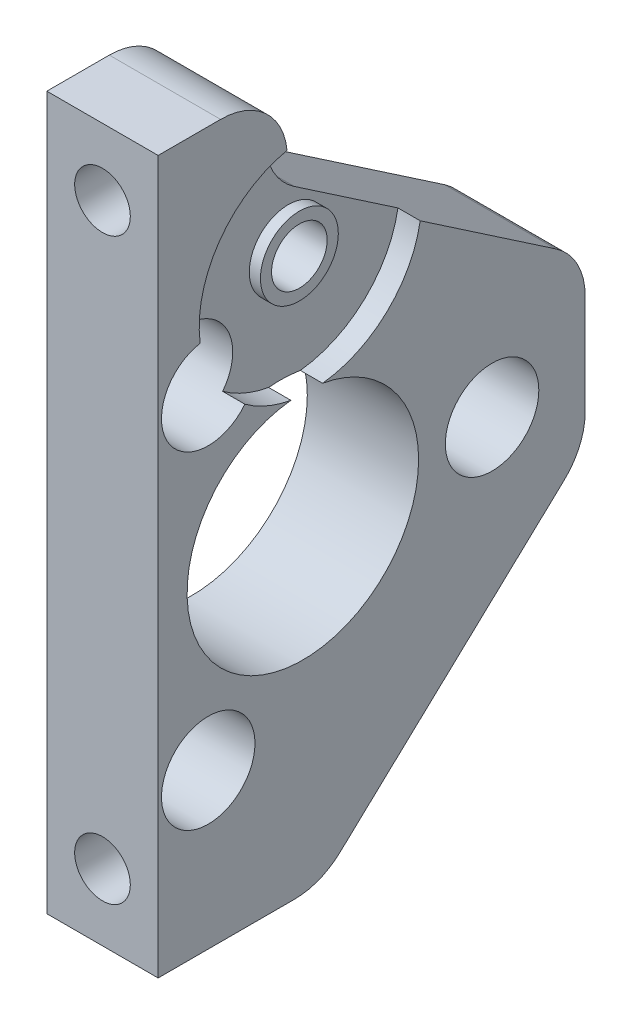
ISO-10303-21;
HEADER;
FILE_DESCRIPTION(('STEP AP214'),'2;1');
FILE_NAME('part.step','',(''),(''),'','','');
FILE_SCHEMA(('AUTOMOTIVE_DESIGN { 1 0 10303 214 1 1 1 1 }'));
ENDSEC;
DATA;
#1=APPLICATION_CONTEXT('core data for automotive mechanical design processes');
#2=APPLICATION_PROTOCOL_DEFINITION('international standard','automotive_design',2000,#1);
#3=PRODUCT_CONTEXT('',#1,'mechanical');
#4=PRODUCT('Part','Part','',(#3));
#5=PRODUCT_RELATED_PRODUCT_CATEGORY('part','',(#4));
#6=PRODUCT_DEFINITION_FORMATION('','',#4);
#7=PRODUCT_DEFINITION_CONTEXT('part definition',#1,'design');
#8=PRODUCT_DEFINITION('design','',#6,#7);
#9=PRODUCT_DEFINITION_SHAPE('','',#8);
#10=(LENGTH_UNIT() NAMED_UNIT(*) SI_UNIT(.MILLI.,.METRE.));
#11=(NAMED_UNIT(*) PLANE_ANGLE_UNIT() SI_UNIT($,.RADIAN.));
#12=(NAMED_UNIT(*) SI_UNIT($,.STERADIAN.) SOLID_ANGLE_UNIT());
#13=UNCERTAINTY_MEASURE_WITH_UNIT(LENGTH_MEASURE(1.E-05),#10,'distance_accuracy_value','');
#14=(GEOMETRIC_REPRESENTATION_CONTEXT(3) GLOBAL_UNCERTAINTY_ASSIGNED_CONTEXT((#13)) GLOBAL_UNIT_ASSIGNED_CONTEXT((#10,
#11,#12)) REPRESENTATION_CONTEXT('',''));
#15=CARTESIAN_POINT('',(0.,0.,0.));
#16=DIRECTION('',(0.,0.,1.));
#17=DIRECTION('',(1.,0.,0.));
#18=AXIS2_PLACEMENT_3D('',#15,#16,#17);
#19=CARTESIAN_POINT('',(-5.,11.7133384494657,1.45675450949772));
#20=DIRECTION('',(1.,0.,0.));
#21=DIRECTION('',(0.,0.,-1.));
#22=AXIS2_PLACEMENT_3D('',#19,#20,#21);
#23=CYLINDRICAL_SURFACE('',#22,1.25);
#24=CARTESIAN_POINT('',(-5.,11.7133384494657,1.45675450949772));
#25=DIRECTION('',(1.,0.,0.));
#26=DIRECTION('',(0.,0.,-1.));
#27=AXIS2_PLACEMENT_3D('',#24,#25,#26);
#28=CIRCLE('',#27,1.25);
#29=CARTESIAN_POINT('',(-5.,11.7133384494657,0.206754509497716));
#30=VERTEX_POINT('',#29);
#31=EDGE_CURVE('E193',#30,#30,#28,.T.);
#32=ORIENTED_EDGE('',*,*,#31,.F.);
#33=EDGE_LOOP('',(#32));
#34=FACE_BOUND('',#33,.T.);
#35=CARTESIAN_POINT('',(-0.5,11.7133384494657,1.45675450949772));
#36=DIRECTION('',(1.,0.,0.));
#37=DIRECTION('',(0.,0.,-1.));
#38=AXIS2_PLACEMENT_3D('',#35,#36,#37);
#39=CIRCLE('',#38,1.25);
#40=CARTESIAN_POINT('',(-0.5,11.7133384494657,0.206754509497716));
#41=VERTEX_POINT('',#40);
#42=EDGE_CURVE('E261',#41,#41,#39,.F.);
#43=ORIENTED_EDGE('',*,*,#42,.F.);
#44=EDGE_LOOP('',(#43));
#45=FACE_BOUND('',#44,.T.);
#46=ADVANCED_FACE('F39',(#34,#45),#23,.F.);
#47=CARTESIAN_POINT('',(-1.,11.7133384494657,1.45675450949772));
#48=DIRECTION('',(1.,0.,0.));
#49=DIRECTION('',(0.,0.,-1.));
#50=AXIS2_PLACEMENT_3D('',#47,#48,#49);
#51=CYLINDRICAL_SURFACE('',#50,1.75);
#52=CARTESIAN_POINT('',(-1.,11.7133384494657,1.45675450949772));
#53=DIRECTION('',(1.,0.,0.));
#54=DIRECTION('',(0.,0.,-1.));
#55=AXIS2_PLACEMENT_3D('',#52,#53,#54);
#56=CIRCLE('',#55,1.75);
#57=CARTESIAN_POINT('',(-1.,11.7133384494657,-0.293245490502285));
#58=VERTEX_POINT('',#57);
#59=EDGE_CURVE('E466',#58,#58,#56,.T.);
#60=ORIENTED_EDGE('',*,*,#59,.T.);
#61=EDGE_LOOP('',(#60));
#62=FACE_BOUND('',#61,.T.);
#63=CARTESIAN_POINT('',(-0.5,11.7133384494657,1.45675450949772));
#64=DIRECTION('',(1.,0.,0.));
#65=DIRECTION('',(0.,0.,-1.));
#66=AXIS2_PLACEMENT_3D('',#63,#64,#65);
#67=CIRCLE('',#66,1.75);
#68=CARTESIAN_POINT('',(-0.5,11.7133384494657,-0.293245490502285));
#69=VERTEX_POINT('',#68);
#70=EDGE_CURVE('E258',#69,#69,#67,.F.);
#71=ORIENTED_EDGE('',*,*,#70,.T.);
#72=EDGE_LOOP('',(#71));
#73=FACE_BOUND('',#72,.T.);
#74=ADVANCED_FACE('F370',(#62,#73),#51,.T.);
#75=CARTESIAN_POINT('',(-5.,8.98038861455546,6.04999999999999));
#76=DIRECTION('',(1.,0.,0.));
#77=DIRECTION('',(0.,0.,-1.));
#78=AXIS2_PLACEMENT_3D('',#75,#76,#77);
#79=CYLINDRICAL_SURFACE('',#78,1.05);
#80=CARTESIAN_POINT('',(-5.,8.98038861455546,6.04999999999999));
#81=DIRECTION('',(1.,0.,0.));
#82=DIRECTION('',(0.,0.,-1.));
#83=AXIS2_PLACEMENT_3D('',#80,#81,#82);
#84=CIRCLE('',#83,1.05);
#85=CARTESIAN_POINT('',(-5.,8.98038861455546,4.99999999999999));
#86=VERTEX_POINT('',#85);
#87=EDGE_CURVE('E206',#86,#86,#84,.T.);
#88=ORIENTED_EDGE('',*,*,#87,.F.);
#89=EDGE_LOOP('',(#88));
#90=FACE_BOUND('',#89,.T.);
#91=CARTESIAN_POINT('',(-3.5,8.98038861455546,6.04999999999999));
#92=DIRECTION('',(1.,0.,0.));
#93=DIRECTION('',(0.,0.,-1.));
#94=AXIS2_PLACEMENT_3D('',#91,#92,#93);
#95=CIRCLE('',#94,1.05);
#96=CARTESIAN_POINT('',(-3.5,8.98038861455546,4.99999999999999));
#97=VERTEX_POINT('',#96);
#98=EDGE_CURVE('E197',#97,#97,#95,.F.);
#99=ORIENTED_EDGE('',*,*,#98,.F.);
#100=EDGE_LOOP('',(#99));
#101=FACE_BOUND('',#100,.T.);
#102=ADVANCED_FACE('F372',(#90,#101),#79,.F.);
#103=CARTESIAN_POINT('',(-5.,1.61917268238771,-6.70000000000001));
#104=DIRECTION('',(1.,0.,0.));
#105=DIRECTION('',(0.,0.,-1.));
#106=AXIS2_PLACEMENT_3D('',#103,#104,#105);
#107=CYLINDRICAL_SURFACE('',#106,1.05);
#108=CARTESIAN_POINT('',(-5.,1.61917268238771,-6.70000000000001));
#109=DIRECTION('',(1.,0.,0.));
#110=DIRECTION('',(0.,0.,-1.));
#111=AXIS2_PLACEMENT_3D('',#108,#109,#110);
#112=CIRCLE('',#111,1.05);
#113=CARTESIAN_POINT('',(-5.,1.61917268238771,-7.75000000000001));
#114=VERTEX_POINT('',#113);
#115=EDGE_CURVE('E203',#114,#114,#112,.T.);
#116=ORIENTED_EDGE('',*,*,#115,.F.);
#117=EDGE_LOOP('',(#116));
#118=FACE_BOUND('',#117,.T.);
#119=CARTESIAN_POINT('',(-3.5,1.61917268238771,-6.70000000000001));
#120=DIRECTION('',(1.,0.,0.));
#121=DIRECTION('',(0.,0.,-1.));
#122=AXIS2_PLACEMENT_3D('',#119,#120,#121);
#123=CIRCLE('',#122,1.05);
#124=CARTESIAN_POINT('',(-3.5,1.61917268238771,-7.75000000000001));
#125=VERTEX_POINT('',#124);
#126=EDGE_CURVE('E255',#125,#125,#123,.F.);
#127=ORIENTED_EDGE('',*,*,#126,.F.);
#128=EDGE_LOOP('',(#127));
#129=FACE_BOUND('',#128,.T.);
#130=ADVANCED_FACE('F381',(#118,#129),#107,.F.);
#131=CARTESIAN_POINT('',(-5.,-5.74204324978,6.05));
#132=DIRECTION('',(1.,0.,0.));
#133=DIRECTION('',(0.,0.,-1.));
#134=AXIS2_PLACEMENT_3D('',#131,#132,#133);
#135=CYLINDRICAL_SURFACE('',#134,1.05);
#136=CARTESIAN_POINT('',(-5.,-5.74204324978,6.05));
#137=DIRECTION('',(1.,0.,0.));
#138=DIRECTION('',(0.,0.,-1.));
#139=AXIS2_PLACEMENT_3D('',#136,#137,#138);
#140=CIRCLE('',#139,1.05);
#141=CARTESIAN_POINT('',(-5.,-5.74204324978,5.));
#142=VERTEX_POINT('',#141);
#143=EDGE_CURVE('E205',#142,#142,#140,.T.);
#144=ORIENTED_EDGE('',*,*,#143,.F.);
#145=EDGE_LOOP('',(#144));
#146=FACE_BOUND('',#145,.T.);
#147=CARTESIAN_POINT('',(-3.5,-5.74204324978,6.05));
#148=DIRECTION('',(1.,0.,0.));
#149=DIRECTION('',(0.,0.,-1.));
#150=AXIS2_PLACEMENT_3D('',#147,#148,#149);
#151=CIRCLE('',#150,1.05);
#152=CARTESIAN_POINT('',(-3.5,-5.74204324978,5.));
#153=VERTEX_POINT('',#152);
#154=EDGE_CURVE('E248',#153,#153,#151,.F.);
#155=ORIENTED_EDGE('',*,*,#154,.F.);
#156=EDGE_LOOP('',(#155));
#157=FACE_BOUND('',#156,.T.);
#158=ADVANCED_FACE('F382',(#146,#157),#135,.F.);
#159=CARTESIAN_POINT('',(-5.,5.83596032605024,-10.8816620981682));
#160=DIRECTION('',(0.,0.82707495501235,-0.562091646256479));
#161=DIRECTION('',(0.,0.562091646256479,0.82707495501235));
#162=AXIS2_PLACEMENT_3D('',#159,#160,#161);
#163=PLANE('',#162);
#164=DIRECTION('',(0.,0.562091646256479,0.82707495501235));
#165=VECTOR('',#164,1.);
#166=CARTESIAN_POINT('',(-5.,5.83596032605024,-10.8816620981682));
#167=LINE('',#166,#165);
#168=CARTESIAN_POINT('',(-5.,6.72878615510035,-9.56793703693767));
#169=VERTEX_POINT('',#168);
#170=CARTESIAN_POINT('',(-5.,14.0364050080066,1.1846663405852));
#171=VERTEX_POINT('',#170);
#172=EDGE_CURVE('E227',#169,#171,#167,.T.);
#173=ORIENTED_EDGE('',*,*,#172,.T.);
#174=DIRECTION('',(1.,0.,0.));
#175=VECTOR('',#174,1.);
#176=CARTESIAN_POINT('',(-1.,14.0364050080066,1.1846663405852));
#177=LINE('',#176,#175);
#178=CARTESIAN_POINT('',(-1.,14.0364050080066,1.1846663405852));
#179=VERTEX_POINT('',#178);
#180=EDGE_CURVE('E293',#171,#179,#177,.T.);
#181=ORIENTED_EDGE('',*,*,#180,.T.);
#182=DIRECTION('',(0.,-0.562091646256479,-0.82707495501235));
#183=VECTOR('',#182,1.);
#184=CARTESIAN_POINT('',(-1.,5.83596032605024,-10.8816620981682));
#185=LINE('',#184,#183);
#186=CARTESIAN_POINT('',(-1.,10.8717332299553,-3.47190663268813));
#187=VERTEX_POINT('',#186);
#188=EDGE_CURVE('E328',#179,#187,#185,.T.);
#189=ORIENTED_EDGE('',*,*,#188,.T.);
#190=DIRECTION('',(1.,0.,0.));
#191=VECTOR('',#190,1.);
#192=CARTESIAN_POINT('',(-1.,10.8717332299553,-3.47190663268813));
#193=LINE('',#192,#191);
#194=CARTESIAN_POINT('',(0.,10.8717332299553,-3.47190663268813));
#195=VERTEX_POINT('',#194);
#196=EDGE_CURVE('E189',#195,#187,#193,.F.);
#197=ORIENTED_EDGE('',*,*,#196,.F.);
#198=DIRECTION('',(0.,0.562091646256479,0.82707495501235));
#199=VECTOR('',#198,1.);
#200=CARTESIAN_POINT('',(0.,5.83596032605024,-10.8816620981682));
#201=LINE('',#200,#199);
#202=CARTESIAN_POINT('',(0.,6.72878615510035,-9.56793703693767));
#203=VERTEX_POINT('',#202);
#204=EDGE_CURVE('E213',#203,#195,#201,.T.);
#205=ORIENTED_EDGE('',*,*,#204,.F.);
#206=DIRECTION('',(1.,0.,0.));
#207=VECTOR('',#206,1.);
#208=CARTESIAN_POINT('',(-5.,6.72878615510035,-9.56793703693767));
#209=LINE('',#208,#207);
#210=EDGE_CURVE('E273',#203,#169,#209,.F.);
#211=ORIENTED_EDGE('',*,*,#210,.T.);
#212=EDGE_LOOP('',(#173,#181,#189,#197,#205,#211));
#213=FACE_BOUND('',#212,.T.);
#214=ADVANCED_FACE('F321',(#213),#163,.T.);
#215=CARTESIAN_POINT('',(-5.,-1.56982123770921,-10.8816620981682));
#216=DIRECTION('',(0.,0.,-1.));
#217=DIRECTION('',(-1.,0.,0.));
#218=AXIS2_PLACEMENT_3D('',#215,#216,#217);
#219=PLANE('',#218);
#220=DIRECTION('',(0.,1.,0.));
#221=VECTOR('',#220,1.);
#222=CARTESIAN_POINT('',(-5.,-1.56982123770921,-10.8816620981682));
#223=LINE('',#222,#221);
#224=CARTESIAN_POINT('',(-5.,-0.270125200310212,-10.8816620981682));
#225=VERTEX_POINT('',#224);
#226=CARTESIAN_POINT('',(-5.,4.2475612900633,-10.8816620981682));
#227=VERTEX_POINT('',#226);
#228=EDGE_CURVE('E221',#225,#227,#223,.T.);
#229=ORIENTED_EDGE('',*,*,#228,.T.);
#230=DIRECTION('',(1.,0.,0.));
#231=VECTOR('',#230,1.);
#232=CARTESIAN_POINT('',(-5.,4.2475612900633,-10.8816620981682));
#233=LINE('',#232,#231);
#234=CARTESIAN_POINT('',(0.,4.2475612900633,-10.8816620981682));
#235=VERTEX_POINT('',#234);
#236=EDGE_CURVE('E267',#227,#235,#233,.T.);
#237=ORIENTED_EDGE('',*,*,#236,.T.);
#238=DIRECTION('',(0.,1.,0.));
#239=VECTOR('',#238,1.);
#240=CARTESIAN_POINT('',(0.,-1.56982123770921,-10.8816620981682));
#241=LINE('',#240,#239);
#242=CARTESIAN_POINT('',(0.,-0.270125200310212,-10.8816620981682));
#243=VERTEX_POINT('',#242);
#244=EDGE_CURVE('E241',#243,#235,#241,.T.);
#245=ORIENTED_EDGE('',*,*,#244,.F.);
#246=DIRECTION('',(1.,0.,0.));
#247=VECTOR('',#246,1.);
#248=CARTESIAN_POINT('',(-5.,-0.270125200310212,-10.8816620981682));
#249=LINE('',#248,#247);
#250=EDGE_CURVE('E174',#243,#225,#249,.F.);
#251=ORIENTED_EDGE('',*,*,#250,.T.);
#252=EDGE_LOOP('',(#229,#237,#245,#251));
#253=FACE_BOUND('',#252,.T.);
#254=ADVANCED_FACE('F488',(#253),#219,.T.);
#255=CARTESIAN_POINT('',(-5.,-12.7,0.990528581608613));
#256=DIRECTION('',(0.,-0.729537204140086,-0.683941128881329));
#257=DIRECTION('',(0.,0.683941128881329,-0.729537204140086));
#258=AXIS2_PLACEMENT_3D('',#255,#256,#257);
#259=PLANE('',#258);
#260=DIRECTION('',(0.,0.683941128881329,-0.729537204140086));
#261=VECTOR('',#260,1.);
#262=CARTESIAN_POINT('',(0.,-12.7,0.990528581608613));
#263=LINE('',#262,#261);
#264=CARTESIAN_POINT('',(0.,-11.8886116124202,0.125047634856885));
#265=VERTEX_POINT('',#264);
#266=CARTESIAN_POINT('',(0.,-2.45873681273047,-9.93348548481223));
#267=VERTEX_POINT('',#266);
#268=EDGE_CURVE('E238',#265,#267,#263,.T.);
#269=ORIENTED_EDGE('',*,*,#268,.F.);
#270=DIRECTION('',(1.,0.,0.));
#271=VECTOR('',#270,1.);
#272=CARTESIAN_POINT('',(-5.,-11.8886116124202,0.125047634856885));
#273=LINE('',#272,#271);
#274=CARTESIAN_POINT('',(-5.,-11.8886116124202,0.125047634856885));
#275=VERTEX_POINT('',#274);
#276=EDGE_CURVE('E286',#265,#275,#273,.F.);
#277=ORIENTED_EDGE('',*,*,#276,.T.);
#278=DIRECTION('',(0.,0.683941128881329,-0.729537204140086));
#279=VECTOR('',#278,1.);
#280=CARTESIAN_POINT('',(-5.,-12.7,0.990528581608613));
#281=LINE('',#280,#279);
#282=CARTESIAN_POINT('',(-5.,-2.45873681273047,-9.93348548481223));
#283=VERTEX_POINT('',#282);
#284=EDGE_CURVE('E222',#275,#283,#281,.T.);
#285=ORIENTED_EDGE('',*,*,#284,.T.);
#286=DIRECTION('',(1.,0.,0.));
#287=VECTOR('',#286,1.);
#288=CARTESIAN_POINT('',(-5.,-2.45873681273047,-9.93348548481223));
#289=LINE('',#288,#287);
#290=EDGE_CURVE('E287',#283,#267,#289,.T.);
#291=ORIENTED_EDGE('',*,*,#290,.T.);
#292=EDGE_LOOP('',(#269,#277,#285,#291));
#293=FACE_BOUND('',#292,.T.);
#294=ADVANCED_FACE('F496',(#293),#259,.T.);
#295=CARTESIAN_POINT('',(-5.,-12.7,8.3));
#296=DIRECTION('',(0.,-1.,0.));
#297=DIRECTION('',(0.,0.,-1.));
#298=AXIS2_PLACEMENT_3D('',#295,#296,#297);
#299=PLANE('',#298);
#300=DIRECTION('',(0.,0.,-1.));
#301=VECTOR('',#300,1.);
#302=CARTESIAN_POINT('',(-5.,-12.7,8.3));
#303=LINE('',#302,#301);
#304=CARTESIAN_POINT('',(-5.,-12.7,8.3));
#305=VERTEX_POINT('',#304);
#306=CARTESIAN_POINT('',(-5.,-12.7,2.17687102150087));
#307=VERTEX_POINT('',#306);
#308=EDGE_CURVE('E216',#305,#307,#303,.T.);
#309=ORIENTED_EDGE('',*,*,#308,.T.);
#310=DIRECTION('',(1.,0.,0.));
#311=VECTOR('',#310,1.);
#312=CARTESIAN_POINT('',(-5.,-12.7,2.17687102150087));
#313=LINE('',#312,#311);
#314=CARTESIAN_POINT('',(0.,-12.7,2.17687102150087));
#315=VERTEX_POINT('',#314);
#316=EDGE_CURVE('E281',#307,#315,#313,.T.);
#317=ORIENTED_EDGE('',*,*,#316,.T.);
#318=DIRECTION('',(0.,0.,-1.));
#319=VECTOR('',#318,1.);
#320=CARTESIAN_POINT('',(0.,-12.7,8.3));
#321=LINE('',#320,#319);
#322=CARTESIAN_POINT('',(0.,-12.7,8.3));
#323=VERTEX_POINT('',#322);
#324=EDGE_CURVE('E232',#323,#315,#321,.T.);
#325=ORIENTED_EDGE('',*,*,#324,.F.);
#326=DIRECTION('',(1.,0.,0.));
#327=VECTOR('',#326,1.);
#328=CARTESIAN_POINT('',(-5.,-12.7,8.3));
#329=LINE('',#328,#327);
#330=EDGE_CURVE('E244',#305,#323,#329,.T.);
#331=ORIENTED_EDGE('',*,*,#330,.F.);
#332=EDGE_LOOP('',(#309,#317,#325,#331));
#333=FACE_BOUND('',#332,.T.);
#334=ADVANCED_FACE('F505',(#333),#299,.T.);
#335=CARTESIAN_POINT('',(-5.,-12.7,8.3));
#336=DIRECTION('',(0.,0.,1.));
#337=DIRECTION('',(1.,0.,0.));
#338=AXIS2_PLACEMENT_3D('',#335,#336,#337);
#339=PLANE('',#338);
#340=CARTESIAN_POINT('',(-2.5,16.3,8.3));
#341=DIRECTION('',(0.,0.,1.));
#342=DIRECTION('',(1.,0.,0.));
#343=AXIS2_PLACEMENT_3D('',#340,#341,#342);
#344=CIRCLE('',#343,1.25);
#345=CARTESIAN_POINT('',(-1.25,16.3,8.3));
#346=VERTEX_POINT('',#345);
#347=EDGE_CURVE('E453',#346,#346,#344,.T.);
#348=ORIENTED_EDGE('',*,*,#347,.F.);
#349=EDGE_LOOP('',(#348));
#350=FACE_BOUND('',#349,.T.);
#351=CARTESIAN_POINT('',(-2.5,-9.69999999999999,8.3));
#352=DIRECTION('',(0.,0.,1.));
#353=DIRECTION('',(1.,0.,0.));
#354=AXIS2_PLACEMENT_3D('',#351,#352,#353);
#355=CIRCLE('',#354,1.25);
#356=CARTESIAN_POINT('',(-1.25,-9.69999999999999,8.3));
#357=VERTEX_POINT('',#356);
#358=EDGE_CURVE('E456',#357,#357,#355,.T.);
#359=ORIENTED_EDGE('',*,*,#358,.F.);
#360=EDGE_LOOP('',(#359));
#361=FACE_BOUND('',#360,.T.);
#362=DIRECTION('',(0.,-1.,0.));
#363=VECTOR('',#362,1.);
#364=CARTESIAN_POINT('',(0.,-12.7,8.3));
#365=LINE('',#364,#363);
#366=CARTESIAN_POINT('',(0.,19.3,8.3));
#367=VERTEX_POINT('',#366);
#368=EDGE_CURVE('E235',#367,#323,#365,.T.);
#369=ORIENTED_EDGE('',*,*,#368,.F.);
#370=DIRECTION('',(1.,0.,0.));
#371=VECTOR('',#370,1.);
#372=CARTESIAN_POINT('',(-5.,19.3,8.3));
#373=LINE('',#372,#371);
#374=CARTESIAN_POINT('',(-5.,19.3,8.3));
#375=VERTEX_POINT('',#374);
#376=EDGE_CURVE('E229',#375,#367,#373,.T.);
#377=ORIENTED_EDGE('',*,*,#376,.F.);
#378=DIRECTION('',(0.,-1.,0.));
#379=VECTOR('',#378,1.);
#380=CARTESIAN_POINT('',(-5.,-12.7,8.3));
#381=LINE('',#380,#379);
#382=EDGE_CURVE('E211',#375,#305,#381,.T.);
#383=ORIENTED_EDGE('',*,*,#382,.T.);
#384=ORIENTED_EDGE('',*,*,#330,.T.);
#385=EDGE_LOOP('',(#369,#377,#383,#384));
#386=FACE_BOUND('',#385,.T.);
#387=ADVANCED_FACE('F506',(#350,#361,#386),#339,.T.);
#388=CARTESIAN_POINT('',(-5.,19.3,8.3));
#389=DIRECTION('',(0.,1.,0.));
#390=DIRECTION('',(0.,0.,1.));
#391=AXIS2_PLACEMENT_3D('',#388,#389,#390);
#392=PLANE('',#391);
#393=DIRECTION('',(0.,0.,1.));
#394=VECTOR('',#393,1.);
#395=CARTESIAN_POINT('',(0.,19.3,8.3));
#396=LINE('',#395,#394);
#397=CARTESIAN_POINT('',(0.,19.3,5.49444320599149));
#398=VERTEX_POINT('',#397);
#399=EDGE_CURVE('E212',#398,#367,#396,.T.);
#400=ORIENTED_EDGE('',*,*,#399,.F.);
#401=DIRECTION('',(1.,0.,0.));
#402=VECTOR('',#401,1.);
#403=CARTESIAN_POINT('',(-5.,19.3,5.49444320599149));
#404=LINE('',#403,#402);
#405=CARTESIAN_POINT('',(-5.,19.3,5.49444320599149));
#406=VERTEX_POINT('',#405);
#407=EDGE_CURVE('E50',#398,#406,#404,.F.);
#408=ORIENTED_EDGE('',*,*,#407,.T.);
#409=DIRECTION('',(0.,0.,1.));
#410=VECTOR('',#409,1.);
#411=CARTESIAN_POINT('',(-5.,19.3,8.3));
#412=LINE('',#411,#410);
#413=EDGE_CURVE('E214',#406,#375,#412,.T.);
#414=ORIENTED_EDGE('',*,*,#413,.T.);
#415=ORIENTED_EDGE('',*,*,#376,.T.);
#416=EDGE_LOOP('',(#400,#408,#414,#415));
#417=FACE_BOUND('',#416,.T.);
#418=ADVANCED_FACE('F363',(#417),#392,.T.);
#419=CARTESIAN_POINT('',(-5.,0.,0.));
#420=DIRECTION('',(-1.,0.,0.));
#421=DIRECTION('',(0.,0.,1.));
#422=AXIS2_PLACEMENT_3D('',#419,#420,#421);
#423=PLANE('',#422);
#424=CARTESIAN_POINT('',(-5.,1.61917268238772,1.8));
#425=DIRECTION('',(1.,0.,0.));
#426=DIRECTION('',(0.,0.,-1.));
#427=AXIS2_PLACEMENT_3D('',#424,#425,#426);
#428=CIRCLE('',#427,5.2);
#429=CARTESIAN_POINT('',(-5.,1.61917268238772,-3.40000000000001));
#430=VERTEX_POINT('',#429);
#431=EDGE_CURVE('E194',#430,#430,#428,.T.);
#432=ORIENTED_EDGE('',*,*,#431,.T.);
#433=EDGE_LOOP('',(#432));
#434=FACE_BOUND('',#433,.T.);
#435=ORIENTED_EDGE('',*,*,#31,.T.);
#436=EDGE_LOOP('',(#435));
#437=FACE_BOUND('',#436,.T.);
#438=ORIENTED_EDGE('',*,*,#143,.T.);
#439=EDGE_LOOP('',(#438));
#440=FACE_BOUND('',#439,.T.);
#441=ORIENTED_EDGE('',*,*,#115,.T.);
#442=EDGE_LOOP('',(#441));
#443=FACE_BOUND('',#442,.T.);
#444=ORIENTED_EDGE('',*,*,#87,.T.);
#445=EDGE_LOOP('',(#444));
#446=FACE_BOUND('',#445,.T.);
#447=ORIENTED_EDGE('',*,*,#413,.F.);
#448=CARTESIAN_POINT('',(-5.,16.3,5.49444320599149));
#449=DIRECTION('',(-1.,0.,0.));
#450=DIRECTION('',(0.,0.,1.));
#451=AXIS2_PLACEMENT_3D('',#448,#449,#450);
#452=CIRCLE('',#451,3.);
#453=CARTESIAN_POINT('',(-5.,16.4088149365218,2.49641730390363));
#454=VERTEX_POINT('',#453);
#455=EDGE_CURVE('E11',#406,#454,#452,.T.);
#456=ORIENTED_EDGE('',*,*,#455,.T.);
#457=CARTESIAN_POINT('',(-5.,16.5176298730436,-0.501608598184237));
#458=DIRECTION('',(-1.,0.,0.));
#459=DIRECTION('',(0.,0.,1.));
#460=AXIS2_PLACEMENT_3D('',#457,#458,#459);
#461=CIRCLE('',#460,3.);
#462=EDGE_CURVE('E300',#454,#171,#461,.F.);
#463=ORIENTED_EDGE('',*,*,#462,.T.);
#464=ORIENTED_EDGE('',*,*,#172,.F.);
#465=CARTESIAN_POINT('',(-5.,4.2475612900633,-7.88166209816824));
#466=DIRECTION('',(-1.,0.,0.));
#467=DIRECTION('',(0.,0.,1.));
#468=AXIS2_PLACEMENT_3D('',#465,#466,#467);
#469=CIRCLE('',#468,3.);
#470=EDGE_CURVE('E283',#169,#227,#469,.T.);
#471=ORIENTED_EDGE('',*,*,#470,.T.);
#472=ORIENTED_EDGE('',*,*,#228,.F.);
#473=CARTESIAN_POINT('',(-5.,-0.270125200310212,-7.88166209816824));
#474=DIRECTION('',(-1.,0.,0.));
#475=DIRECTION('',(0.,0.,1.));
#476=AXIS2_PLACEMENT_3D('',#473,#474,#475);
#477=CIRCLE('',#476,3.);
#478=EDGE_CURVE('E279',#225,#283,#477,.T.);
#479=ORIENTED_EDGE('',*,*,#478,.T.);
#480=ORIENTED_EDGE('',*,*,#284,.F.);
#481=CARTESIAN_POINT('',(-5.,-9.69999999999999,2.17687102150087));
#482=DIRECTION('',(-1.,0.,0.));
#483=DIRECTION('',(0.,0.,1.));
#484=AXIS2_PLACEMENT_3D('',#481,#482,#483);
#485=CIRCLE('',#484,3.);
#486=EDGE_CURVE('E276',#275,#307,#485,.T.);
#487=ORIENTED_EDGE('',*,*,#486,.T.);
#488=ORIENTED_EDGE('',*,*,#308,.F.);
#489=ORIENTED_EDGE('',*,*,#382,.F.);
#490=EDGE_LOOP('',(#447,#456,#463,#464,#471,#472,#479,#480,#487,#488,#489));
#491=FACE_BOUND('',#490,.T.);
#492=ADVANCED_FACE('F320',(#434,#437,#440,#443,#446,#491),#423,.T.);
#493=CARTESIAN_POINT('',(0.,0.,0.));
#494=DIRECTION('',(-1.,0.,0.));
#495=DIRECTION('',(0.,0.,1.));
#496=AXIS2_PLACEMENT_3D('',#493,#494,#495);
#497=PLANE('',#496);
#498=CARTESIAN_POINT('',(0.,1.61917268238771,-6.70000000000001));
#499=DIRECTION('',(1.,0.,0.));
#500=DIRECTION('',(0.,0.,-1.));
#501=AXIS2_PLACEMENT_3D('',#498,#499,#500);
#502=CIRCLE('',#501,2.1);
#503=CARTESIAN_POINT('',(0.,1.61917268238771,-8.80000000000001));
#504=VERTEX_POINT('',#503);
#505=EDGE_CURVE('E344',#504,#504,#502,.T.);
#506=ORIENTED_EDGE('',*,*,#505,.F.);
#507=EDGE_LOOP('',(#506));
#508=FACE_BOUND('',#507,.T.);
#509=CARTESIAN_POINT('',(0.,-5.74204324978001,6.05));
#510=DIRECTION('',(1.,0.,0.));
#511=DIRECTION('',(0.,0.,-1.));
#512=AXIS2_PLACEMENT_3D('',#509,#510,#511);
#513=CIRCLE('',#512,2.1);
#514=CARTESIAN_POINT('',(0.,-5.74204324978001,3.95));
#515=VERTEX_POINT('',#514);
#516=EDGE_CURVE('E184',#515,#515,#513,.T.);
#517=ORIENTED_EDGE('',*,*,#516,.F.);
#518=EDGE_LOOP('',(#517));
#519=FACE_BOUND('',#518,.T.);
#520=CARTESIAN_POINT('',(0.,11.7133384494657,1.45675450949772));
#521=DIRECTION('',(1.,0.,0.));
#522=DIRECTION('',(0.,0.,-1.));
#523=AXIS2_PLACEMENT_3D('',#520,#521,#522);
#524=CIRCLE('',#523,4.99999999999999);
#525=CARTESIAN_POINT('',(0.,16.6012322544908,2.50960499783776));
#526=VERTEX_POINT('',#525);
#527=CARTESIAN_POINT('',(0.,11.0488810176278,6.41240747568444));
#528=VERTEX_POINT('',#527);
#529=EDGE_CURVE('E157',#526,#528,#524,.T.);
#530=ORIENTED_EDGE('',*,*,#529,.F.);
#531=CARTESIAN_POINT('',(0.,16.3,5.49444320599149));
#532=DIRECTION('',(-1.,0.,0.));
#533=DIRECTION('',(0.,0.,1.));
#534=AXIS2_PLACEMENT_3D('',#531,#532,#533);
#535=CIRCLE('',#534,3.);
#536=EDGE_CURVE('E62',#526,#398,#535,.F.);
#537=ORIENTED_EDGE('',*,*,#536,.T.);
#538=ORIENTED_EDGE('',*,*,#399,.T.);
#539=ORIENTED_EDGE('',*,*,#368,.T.);
#540=ORIENTED_EDGE('',*,*,#324,.T.);
#541=CARTESIAN_POINT('',(0.,-9.69999999999999,2.17687102150087));
#542=DIRECTION('',(-1.,0.,0.));
#543=DIRECTION('',(0.,0.,1.));
#544=AXIS2_PLACEMENT_3D('',#541,#542,#543);
#545=CIRCLE('',#544,3.);
#546=EDGE_CURVE('E272',#315,#265,#545,.F.);
#547=ORIENTED_EDGE('',*,*,#546,.T.);
#548=ORIENTED_EDGE('',*,*,#268,.T.);
#549=CARTESIAN_POINT('',(0.,-0.270125200310212,-7.88166209816824));
#550=DIRECTION('',(-1.,0.,0.));
#551=DIRECTION('',(0.,0.,1.));
#552=AXIS2_PLACEMENT_3D('',#549,#550,#551);
#553=CIRCLE('',#552,3.);
#554=EDGE_CURVE('E266',#267,#243,#553,.F.);
#555=ORIENTED_EDGE('',*,*,#554,.T.);
#556=ORIENTED_EDGE('',*,*,#244,.T.);
#557=CARTESIAN_POINT('',(0.,4.2475612900633,-7.88166209816824));
#558=DIRECTION('',(-1.,0.,0.));
#559=DIRECTION('',(0.,0.,1.));
#560=AXIS2_PLACEMENT_3D('',#557,#558,#559);
#561=CIRCLE('',#560,3.);
#562=EDGE_CURVE('E271',#235,#203,#561,.F.);
#563=ORIENTED_EDGE('',*,*,#562,.T.);
#564=ORIENTED_EDGE('',*,*,#204,.T.);
#565=CARTESIAN_POINT('',(0.,6.74298170194202,0.913105907599996));
#566=VERTEX_POINT('',#565);
#567=EDGE_CURVE('E166',#566,#195,#524,.T.);
#568=ORIENTED_EDGE('',*,*,#567,.F.);
#569=CARTESIAN_POINT('',(0.,1.61917268238772,1.8));
#570=DIRECTION('',(1.,0.,0.));
#571=DIRECTION('',(0.,0.,-1.));
#572=AXIS2_PLACEMENT_3D('',#569,#570,#571);
#573=CIRCLE('',#572,5.2);
#574=CARTESIAN_POINT('',(0.,6.79139295471137,2.33678436505207));
#575=VERTEX_POINT('',#574);
#576=EDGE_CURVE('E198',#575,#566,#573,.T.);
#577=ORIENTED_EDGE('',*,*,#576,.F.);
#578=CARTESIAN_POINT('',(0.,7.67503483831163,4.40499193958023));
#579=VERTEX_POINT('',#578);
#580=EDGE_CURVE('E168',#579,#575,#524,.T.);
#581=ORIENTED_EDGE('',*,*,#580,.F.);
#582=CARTESIAN_POINT('',(0.,8.98038861455546,6.04999999999999));
#583=DIRECTION('',(1.,0.,0.));
#584=DIRECTION('',(0.,0.,-1.));
#585=AXIS2_PLACEMENT_3D('',#582,#583,#584);
#586=CIRCLE('',#585,2.1);
#587=EDGE_CURVE('E173',#528,#579,#586,.T.);
#588=ORIENTED_EDGE('',*,*,#587,.F.);
#589=EDGE_LOOP('',(#530,#537,#538,#539,#540,#547,#548,#555,#556,#563,#564,#568,#577,#581,#588));
#590=FACE_BOUND('',#589,.T.);
#591=ADVANCED_FACE('F177',(#508,#519,#590),#497,.F.);
#592=CARTESIAN_POINT('',(-5.,1.61917268238772,1.8));
#593=DIRECTION('',(1.,0.,0.));
#594=DIRECTION('',(0.,0.,-1.));
#595=AXIS2_PLACEMENT_3D('',#592,#593,#594);
#596=CYLINDRICAL_SURFACE('',#595,5.2);
#597=ORIENTED_EDGE('',*,*,#431,.F.);
#598=EDGE_LOOP('',(#597));
#599=FACE_BOUND('',#598,.T.);
#600=CARTESIAN_POINT('',(-1.,1.61917268238772,1.8));
#601=DIRECTION('',(1.,0.,0.));
#602=DIRECTION('',(0.,0.,-1.));
#603=AXIS2_PLACEMENT_3D('',#600,#601,#602);
#604=CIRCLE('',#603,5.2);
#605=CARTESIAN_POINT('',(-1.,6.79139295471137,2.33678436505207));
#606=VERTEX_POINT('',#605);
#607=CARTESIAN_POINT('',(-1.,6.74298170194202,0.913105907599996));
#608=VERTEX_POINT('',#607);
#609=EDGE_CURVE('E311',#606,#608,#604,.F.);
#610=ORIENTED_EDGE('',*,*,#609,.F.);
#611=DIRECTION('',(1.,0.,0.));
#612=VECTOR('',#611,1.);
#613=CARTESIAN_POINT('',(-0.5,6.79139295471137,2.33678436505207));
#614=LINE('',#613,#612);
#615=EDGE_CURVE('E334',#606,#575,#614,.T.);
#616=ORIENTED_EDGE('',*,*,#615,.T.);
#617=ORIENTED_EDGE('',*,*,#576,.T.);
#618=DIRECTION('',(1.,0.,0.));
#619=VECTOR('',#618,1.);
#620=CARTESIAN_POINT('',(-0.5,6.74298170194203,0.913105907599991));
#621=LINE('',#620,#619);
#622=EDGE_CURVE('E329',#566,#608,#621,.F.);
#623=ORIENTED_EDGE('',*,*,#622,.T.);
#624=EDGE_LOOP('',(#610,#616,#617,#623));
#625=FACE_BOUND('',#624,.T.);
#626=ADVANCED_FACE('F349',(#599,#625),#596,.F.);
#627=CARTESIAN_POINT('',(-3.5,-5.74204324978001,6.05));
#628=DIRECTION('',(1.,0.,0.));
#629=DIRECTION('',(0.,0.,-1.));
#630=AXIS2_PLACEMENT_3D('',#627,#628,#629);
#631=PLANE('',#630);
#632=CARTESIAN_POINT('',(-3.5,-5.74204324978001,6.05));
#633=DIRECTION('',(1.,0.,0.));
#634=DIRECTION('',(0.,0.,-1.));
#635=AXIS2_PLACEMENT_3D('',#632,#633,#634);
#636=CIRCLE('',#635,2.1);
#637=CARTESIAN_POINT('',(-3.5,-5.74204324978001,3.95));
#638=VERTEX_POINT('',#637);
#639=EDGE_CURVE('E181',#638,#638,#636,.T.);
#640=ORIENTED_EDGE('',*,*,#639,.T.);
#641=EDGE_LOOP('',(#640));
#642=FACE_BOUND('',#641,.T.);
#643=ORIENTED_EDGE('',*,*,#154,.T.);
#644=EDGE_LOOP('',(#643));
#645=FACE_BOUND('',#644,.T.);
#646=ADVANCED_FACE('F356',(#642,#645),#631,.T.);
#647=CARTESIAN_POINT('',(-3.5,-5.74204324978001,6.05));
#648=DIRECTION('',(1.,0.,0.));
#649=DIRECTION('',(0.,0.,-1.));
#650=AXIS2_PLACEMENT_3D('',#647,#648,#649);
#651=CYLINDRICAL_SURFACE('',#650,2.1);
#652=ORIENTED_EDGE('',*,*,#639,.F.);
#653=EDGE_LOOP('',(#652));
#654=FACE_BOUND('',#653,.T.);
#655=ORIENTED_EDGE('',*,*,#516,.T.);
#656=EDGE_LOOP('',(#655));
#657=FACE_BOUND('',#656,.T.);
#658=ADVANCED_FACE('F350',(#654,#657),#651,.F.);
#659=CARTESIAN_POINT('',(-3.5,1.61917268238771,-6.70000000000001));
#660=DIRECTION('',(1.,0.,0.));
#661=DIRECTION('',(0.,0.,-1.));
#662=AXIS2_PLACEMENT_3D('',#659,#660,#661);
#663=PLANE('',#662);
#664=CARTESIAN_POINT('',(-3.5,1.61917268238771,-6.70000000000001));
#665=DIRECTION('',(1.,0.,0.));
#666=DIRECTION('',(0.,0.,-1.));
#667=AXIS2_PLACEMENT_3D('',#664,#665,#666);
#668=CIRCLE('',#667,2.1);
#669=CARTESIAN_POINT('',(-3.5,1.61917268238771,-8.80000000000001));
#670=VERTEX_POINT('',#669);
#671=EDGE_CURVE('E254',#670,#670,#668,.T.);
#672=ORIENTED_EDGE('',*,*,#671,.T.);
#673=EDGE_LOOP('',(#672));
#674=FACE_BOUND('',#673,.T.);
#675=ORIENTED_EDGE('',*,*,#126,.T.);
#676=EDGE_LOOP('',(#675));
#677=FACE_BOUND('',#676,.T.);
#678=ADVANCED_FACE('F409',(#674,#677),#663,.T.);
#679=CARTESIAN_POINT('',(-3.5,1.61917268238771,-6.70000000000001));
#680=DIRECTION('',(1.,0.,0.));
#681=DIRECTION('',(0.,0.,-1.));
#682=AXIS2_PLACEMENT_3D('',#679,#680,#681);
#683=CYLINDRICAL_SURFACE('',#682,2.1);
#684=ORIENTED_EDGE('',*,*,#671,.F.);
#685=EDGE_LOOP('',(#684));
#686=FACE_BOUND('',#685,.T.);
#687=ORIENTED_EDGE('',*,*,#505,.T.);
#688=EDGE_LOOP('',(#687));
#689=FACE_BOUND('',#688,.T.);
#690=ADVANCED_FACE('F396',(#686,#689),#683,.F.);
#691=CARTESIAN_POINT('',(-3.5,8.98038861455546,6.04999999999999));
#692=DIRECTION('',(1.,0.,0.));
#693=DIRECTION('',(0.,0.,-1.));
#694=AXIS2_PLACEMENT_3D('',#691,#692,#693);
#695=PLANE('',#694);
#696=CARTESIAN_POINT('',(-3.5,8.98038861455546,6.04999999999999));
#697=DIRECTION('',(1.,0.,0.));
#698=DIRECTION('',(0.,0.,-1.));
#699=AXIS2_PLACEMENT_3D('',#696,#697,#698);
#700=CIRCLE('',#699,2.1);
#701=CARTESIAN_POINT('',(-3.5,8.98038861455546,3.94999999999999));
#702=VERTEX_POINT('',#701);
#703=EDGE_CURVE('E185',#702,#702,#700,.T.);
#704=ORIENTED_EDGE('',*,*,#703,.T.);
#705=EDGE_LOOP('',(#704));
#706=FACE_BOUND('',#705,.T.);
#707=ORIENTED_EDGE('',*,*,#98,.T.);
#708=EDGE_LOOP('',(#707));
#709=FACE_BOUND('',#708,.T.);
#710=ADVANCED_FACE('F400',(#706,#709),#695,.T.);
#711=CARTESIAN_POINT('',(-3.5,8.98038861455546,6.04999999999999));
#712=DIRECTION('',(1.,0.,0.));
#713=DIRECTION('',(0.,0.,-1.));
#714=AXIS2_PLACEMENT_3D('',#711,#712,#713);
#715=CYLINDRICAL_SURFACE('',#714,2.1);
#716=ORIENTED_EDGE('',*,*,#703,.F.);
#717=EDGE_LOOP('',(#716));
#718=FACE_BOUND('',#717,.T.);
#719=CARTESIAN_POINT('',(-1.,8.98038861455546,6.04999999999999));
#720=DIRECTION('',(1.,0.,0.));
#721=DIRECTION('',(0.,0.,-1.));
#722=AXIS2_PLACEMENT_3D('',#719,#720,#721);
#723=CIRCLE('',#722,2.1);
#724=CARTESIAN_POINT('',(-1.,11.0488810176278,6.41240747568444));
#725=VERTEX_POINT('',#724);
#726=CARTESIAN_POINT('',(-1.,7.67503483831163,4.40499193958023));
#727=VERTEX_POINT('',#726);
#728=EDGE_CURVE('E172',#725,#727,#723,.F.);
#729=ORIENTED_EDGE('',*,*,#728,.F.);
#730=DIRECTION('',(1.,0.,0.));
#731=VECTOR('',#730,1.);
#732=CARTESIAN_POINT('',(-0.5,11.0488810176278,6.41240747568444));
#733=LINE('',#732,#731);
#734=EDGE_CURVE('E158',#725,#528,#733,.T.);
#735=ORIENTED_EDGE('',*,*,#734,.T.);
#736=ORIENTED_EDGE('',*,*,#587,.T.);
#737=DIRECTION('',(1.,0.,0.));
#738=VECTOR('',#737,1.);
#739=CARTESIAN_POINT('',(-0.5,7.67503483831163,4.40499193958023));
#740=LINE('',#739,#738);
#741=EDGE_CURVE('E176',#579,#727,#740,.F.);
#742=ORIENTED_EDGE('',*,*,#741,.T.);
#743=EDGE_LOOP('',(#729,#735,#736,#742));
#744=FACE_BOUND('',#743,.T.);
#745=ADVANCED_FACE('F171',(#718,#744),#715,.F.);
#746=CARTESIAN_POINT('',(-1.,11.7133384494657,1.45675450949772));
#747=DIRECTION('',(1.,0.,0.));
#748=DIRECTION('',(0.,0.,-1.));
#749=AXIS2_PLACEMENT_3D('',#746,#747,#748);
#750=CYLINDRICAL_SURFACE('',#749,4.99999999999999);
#751=CARTESIAN_POINT('',(-1.,11.7133384494657,1.45675450949772));
#752=DIRECTION('',(1.,0.,0.));
#753=DIRECTION('',(0.,0.,-1.));
#754=AXIS2_PLACEMENT_3D('',#751,#752,#753);
#755=CIRCLE('',#754,4.99999999999999);
#756=CARTESIAN_POINT('',(-1.,16.6012322544908,2.50960499783776));
#757=VERTEX_POINT('',#756);
#758=EDGE_CURVE('E310',#757,#725,#755,.T.);
#759=ORIENTED_EDGE('',*,*,#758,.F.);
#760=DIRECTION('',(1.,0.,0.));
#761=VECTOR('',#760,1.);
#762=CARTESIAN_POINT('',(-1.,16.6012322544908,2.50960499783776));
#763=LINE('',#762,#761);
#764=EDGE_CURVE('E161',#757,#526,#763,.T.);
#765=ORIENTED_EDGE('',*,*,#764,.T.);
#766=ORIENTED_EDGE('',*,*,#529,.T.);
#767=ORIENTED_EDGE('',*,*,#734,.F.);
#768=EDGE_LOOP('',(#759,#765,#766,#767));
#769=FACE_BOUND('',#768,.T.);
#770=ADVANCED_FACE('F156',(#769),#750,.F.);
#771=EDGE_CURVE('E315',#727,#606,#755,.T.);
#772=ORIENTED_EDGE('',*,*,#771,.F.);
#773=ORIENTED_EDGE('',*,*,#741,.F.);
#774=ORIENTED_EDGE('',*,*,#580,.T.);
#775=ORIENTED_EDGE('',*,*,#615,.F.);
#776=EDGE_LOOP('',(#772,#773,#774,#775));
#777=FACE_BOUND('',#776,.T.);
#778=ADVANCED_FACE('F423',(#777),#750,.F.);
#779=ORIENTED_EDGE('',*,*,#196,.T.);
#780=EDGE_CURVE('E164',#608,#187,#755,.T.);
#781=ORIENTED_EDGE('',*,*,#780,.F.);
#782=ORIENTED_EDGE('',*,*,#622,.F.);
#783=ORIENTED_EDGE('',*,*,#567,.T.);
#784=EDGE_LOOP('',(#779,#781,#782,#783));
#785=FACE_BOUND('',#784,.T.);
#786=ADVANCED_FACE('F422',(#785),#750,.F.);
#787=CARTESIAN_POINT('',(-1.,11.7133384494657,1.45675450949772));
#788=DIRECTION('',(1.,0.,0.));
#789=DIRECTION('',(0.,0.,-1.));
#790=AXIS2_PLACEMENT_3D('',#787,#788,#789);
#791=PLANE('',#790);
#792=ORIENTED_EDGE('',*,*,#59,.F.);
#793=EDGE_LOOP('',(#792));
#794=FACE_BOUND('',#793,.T.);
#795=CARTESIAN_POINT('',(-1.,16.5176298730436,-0.501608598184237));
#796=DIRECTION('',(1.,0.,0.));
#797=DIRECTION('',(0.,0.,-1.));
#798=AXIS2_PLACEMENT_3D('',#795,#796,#797);
#799=CIRCLE('',#798,3.);
#800=CARTESIAN_POINT('',(-1.,16.4088149365218,2.49641730390363));
#801=VERTEX_POINT('',#800);
#802=EDGE_CURVE('E295',#179,#801,#799,.F.);
#803=ORIENTED_EDGE('',*,*,#802,.T.);
#804=CARTESIAN_POINT('',(-1.,16.3,5.49444320599149));
#805=DIRECTION('',(1.,0.,0.));
#806=DIRECTION('',(0.,0.,-1.));
#807=AXIS2_PLACEMENT_3D('',#804,#805,#806);
#808=CIRCLE('',#807,3.);
#809=EDGE_CURVE('E305',#801,#757,#808,.T.);
#810=ORIENTED_EDGE('',*,*,#809,.T.);
#811=ORIENTED_EDGE('',*,*,#758,.T.);
#812=ORIENTED_EDGE('',*,*,#728,.T.);
#813=ORIENTED_EDGE('',*,*,#771,.T.);
#814=ORIENTED_EDGE('',*,*,#609,.T.);
#815=ORIENTED_EDGE('',*,*,#780,.T.);
#816=ORIENTED_EDGE('',*,*,#188,.F.);
#817=EDGE_LOOP('',(#803,#810,#811,#812,#813,#814,#815,#816));
#818=FACE_BOUND('',#817,.T.);
#819=ADVANCED_FACE('F306',(#794,#818),#791,.T.);
#820=CARTESIAN_POINT('',(-0.5,11.7133384494657,1.45675450949772));
#821=DIRECTION('',(1.,0.,0.));
#822=DIRECTION('',(0.,0.,-1.));
#823=AXIS2_PLACEMENT_3D('',#820,#821,#822);
#824=PLANE('',#823);
#825=ORIENTED_EDGE('',*,*,#70,.F.);
#826=EDGE_LOOP('',(#825));
#827=FACE_BOUND('',#826,.T.);
#828=ORIENTED_EDGE('',*,*,#42,.T.);
#829=EDGE_LOOP('',(#828));
#830=FACE_BOUND('',#829,.T.);
#831=ADVANCED_FACE('F425',(#827,#830),#824,.T.);
#832=CARTESIAN_POINT('',(-2.5,-9.69999999999999,3.3));
#833=DIRECTION('',(0.,0.,1.));
#834=DIRECTION('',(1.,0.,0.));
#835=AXIS2_PLACEMENT_3D('',#832,#833,#834);
#836=CYLINDRICAL_SURFACE('',#835,1.25);
#837=CARTESIAN_POINT('',(-2.5,-9.69999999999999,3.3));
#838=DIRECTION('',(0.,0.,1.));
#839=DIRECTION('',(1.,0.,0.));
#840=AXIS2_PLACEMENT_3D('',#837,#838,#839);
#841=CIRCLE('',#840,1.25);
#842=CARTESIAN_POINT('',(-1.25,-9.69999999999999,3.3));
#843=VERTEX_POINT('',#842);
#844=EDGE_CURVE('E464',#843,#843,#841,.T.);
#845=ORIENTED_EDGE('',*,*,#844,.F.);
#846=EDGE_LOOP('',(#845));
#847=FACE_BOUND('',#846,.T.);
#848=ORIENTED_EDGE('',*,*,#358,.T.);
#849=EDGE_LOOP('',(#848));
#850=FACE_BOUND('',#849,.T.);
#851=ADVANCED_FACE('F429',(#847,#850),#836,.F.);
#852=CARTESIAN_POINT('',(-2.5,-9.69999999999999,3.3));
#853=DIRECTION('',(0.,0.,1.));
#854=DIRECTION('',(1.,0.,0.));
#855=AXIS2_PLACEMENT_3D('',#852,#853,#854);
#856=PLANE('',#855);
#857=ORIENTED_EDGE('',*,*,#844,.T.);
#858=EDGE_LOOP('',(#857));
#859=FACE_BOUND('',#858,.T.);
#860=ADVANCED_FACE('F431',(#859),#856,.T.);
#861=CARTESIAN_POINT('',(-2.5,16.3,3.3));
#862=DIRECTION('',(0.,0.,1.));
#863=DIRECTION('',(1.,0.,0.));
#864=AXIS2_PLACEMENT_3D('',#861,#862,#863);
#865=CYLINDRICAL_SURFACE('',#864,1.25);
#866=CARTESIAN_POINT('',(-2.5,16.3,3.3));
#867=DIRECTION('',(0.,0.,1.));
#868=DIRECTION('',(1.,0.,0.));
#869=AXIS2_PLACEMENT_3D('',#866,#867,#868);
#870=CIRCLE('',#869,1.25);
#871=CARTESIAN_POINT('',(-1.25,16.3,3.3));
#872=VERTEX_POINT('',#871);
#873=EDGE_CURVE('E262',#872,#872,#870,.T.);
#874=ORIENTED_EDGE('',*,*,#873,.F.);
#875=EDGE_LOOP('',(#874));
#876=FACE_BOUND('',#875,.T.);
#877=ORIENTED_EDGE('',*,*,#347,.T.);
#878=EDGE_LOOP('',(#877));
#879=FACE_BOUND('',#878,.T.);
#880=ADVANCED_FACE('F432',(#876,#879),#865,.F.);
#881=CARTESIAN_POINT('',(-2.5,16.3,3.3));
#882=DIRECTION('',(0.,0.,1.));
#883=DIRECTION('',(1.,0.,0.));
#884=AXIS2_PLACEMENT_3D('',#881,#882,#883);
#885=PLANE('',#884);
#886=ORIENTED_EDGE('',*,*,#873,.T.);
#887=EDGE_LOOP('',(#886));
#888=FACE_BOUND('',#887,.T.);
#889=ADVANCED_FACE('F441',(#888),#885,.T.);
#890=CARTESIAN_POINT('',(-5.,4.2475612900633,-7.88166209816824));
#891=DIRECTION('',(1.,0.,0.));
#892=DIRECTION('',(0.,0.,-1.));
#893=AXIS2_PLACEMENT_3D('',#890,#891,#892);
#894=CYLINDRICAL_SURFACE('',#893,3.);
#895=ORIENTED_EDGE('',*,*,#470,.F.);
#896=ORIENTED_EDGE('',*,*,#210,.F.);
#897=ORIENTED_EDGE('',*,*,#562,.F.);
#898=ORIENTED_EDGE('',*,*,#236,.F.);
#899=EDGE_LOOP('',(#895,#896,#897,#898));
#900=FACE_BOUND('',#899,.T.);
#901=ADVANCED_FACE('F443',(#900),#894,.T.);
#902=CARTESIAN_POINT('',(-5.,-9.69999999999999,2.17687102150087));
#903=DIRECTION('',(1.,0.,0.));
#904=DIRECTION('',(0.,0.,-1.));
#905=AXIS2_PLACEMENT_3D('',#902,#903,#904);
#906=CYLINDRICAL_SURFACE('',#905,3.);
#907=ORIENTED_EDGE('',*,*,#486,.F.);
#908=ORIENTED_EDGE('',*,*,#276,.F.);
#909=ORIENTED_EDGE('',*,*,#546,.F.);
#910=ORIENTED_EDGE('',*,*,#316,.F.);
#911=EDGE_LOOP('',(#907,#908,#909,#910));
#912=FACE_BOUND('',#911,.T.);
#913=ADVANCED_FACE('F448',(#912),#906,.T.);
#914=CARTESIAN_POINT('',(-5.,-0.270125200310212,-7.88166209816824));
#915=DIRECTION('',(1.,0.,0.));
#916=DIRECTION('',(0.,0.,-1.));
#917=AXIS2_PLACEMENT_3D('',#914,#915,#916);
#918=CYLINDRICAL_SURFACE('',#917,3.);
#919=ORIENTED_EDGE('',*,*,#478,.F.);
#920=ORIENTED_EDGE('',*,*,#250,.F.);
#921=ORIENTED_EDGE('',*,*,#554,.F.);
#922=ORIENTED_EDGE('',*,*,#290,.F.);
#923=EDGE_LOOP('',(#919,#920,#921,#922));
#924=FACE_BOUND('',#923,.T.);
#925=ADVANCED_FACE('F489',(#924),#918,.T.);
#926=CARTESIAN_POINT('',(-5.,16.5176298730436,-0.501608598184237));
#927=DIRECTION('',(-1.,0.,0.));
#928=DIRECTION('',(0.,0.,1.));
#929=AXIS2_PLACEMENT_3D('',#926,#927,#928);
#930=CYLINDRICAL_SURFACE('',#929,3.);
#931=ORIENTED_EDGE('',*,*,#462,.F.);
#932=DIRECTION('',(-1.,0.,0.));
#933=VECTOR('',#932,1.);
#934=CARTESIAN_POINT('',(-5.,16.4088149365218,2.49641730390363));
#935=LINE('',#934,#933);
#936=EDGE_CURVE('E299',#454,#801,#935,.F.);
#937=ORIENTED_EDGE('',*,*,#936,.T.);
#938=ORIENTED_EDGE('',*,*,#802,.F.);
#939=ORIENTED_EDGE('',*,*,#180,.F.);
#940=EDGE_LOOP('',(#931,#937,#938,#939));
#941=FACE_BOUND('',#940,.T.);
#942=ADVANCED_FACE('F324',(#941),#930,.F.);
#943=CARTESIAN_POINT('',(-5.,16.3,5.49444320599149));
#944=DIRECTION('',(-1.,0.,0.));
#945=DIRECTION('',(0.,0.,1.));
#946=AXIS2_PLACEMENT_3D('',#943,#944,#945);
#947=CYLINDRICAL_SURFACE('',#946,3.);
#948=ORIENTED_EDGE('',*,*,#455,.F.);
#949=ORIENTED_EDGE('',*,*,#407,.F.);
#950=ORIENTED_EDGE('',*,*,#536,.F.);
#951=ORIENTED_EDGE('',*,*,#764,.F.);
#952=ORIENTED_EDGE('',*,*,#809,.F.);
#953=ORIENTED_EDGE('',*,*,#936,.F.);
#954=EDGE_LOOP('',(#948,#949,#950,#951,#952,#953));
#955=FACE_BOUND('',#954,.T.);
#956=ADVANCED_FACE('F41',(#955),#947,.T.);
#957=CLOSED_SHELL('',(#46,#74,#102,#130,#158,#214,#254,#294,#334,#387,#418,#492,#591,#626,#646,
#658,#678,#690,#710,#745,#770,#778,#786,#819,#831,#851,#860,#880,#889,#901,#913,#925,#942,#956));
#958=MANIFOLD_SOLID_BREP('B2',#957);
#959=ADVANCED_BREP_SHAPE_REPRESENTATION('',(#18,#958),#14);
#960=SHAPE_DEFINITION_REPRESENTATION(#9,#959);
ENDSEC;
END-ISO-10303-21;
